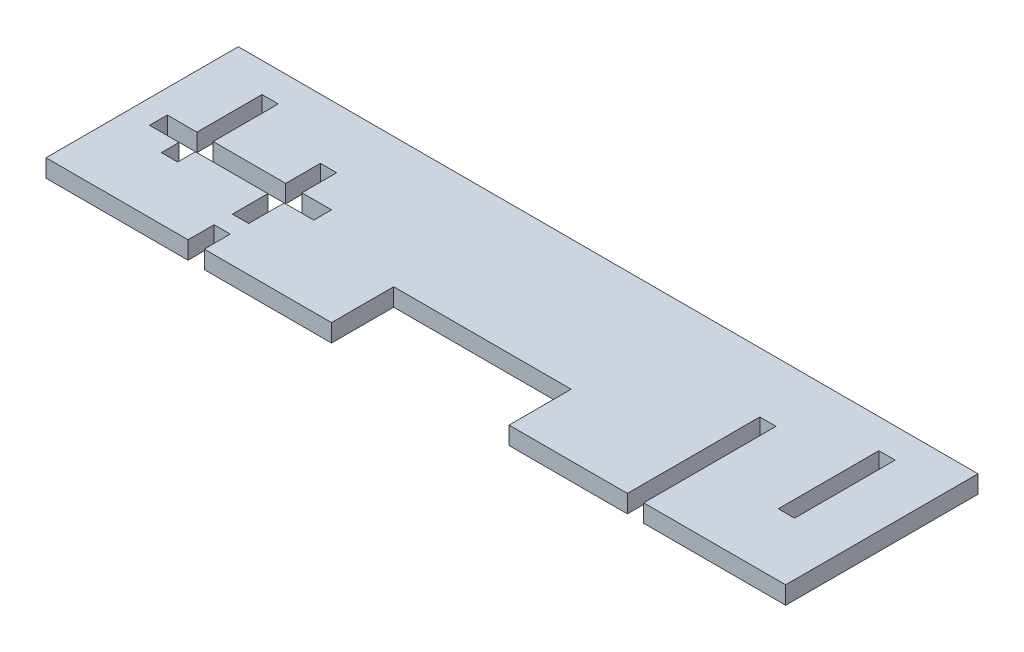
ISO-10303-21;
HEADER;
FILE_DESCRIPTION(('STEP AP214'),'2;1');
FILE_NAME('part.step','',(''),(''),'','','');
FILE_SCHEMA(('AUTOMOTIVE_DESIGN { 1 0 10303 214 1 1 1 1 }'));
ENDSEC;
DATA;
#1=APPLICATION_CONTEXT('core data for automotive mechanical design processes');
#2=APPLICATION_PROTOCOL_DEFINITION('international standard','automotive_design',2000,#1);
#3=PRODUCT_CONTEXT('',#1,'mechanical');
#4=PRODUCT('Part','Part','',(#3));
#5=PRODUCT_RELATED_PRODUCT_CATEGORY('part','',(#4));
#6=PRODUCT_DEFINITION_FORMATION('','',#4);
#7=PRODUCT_DEFINITION_CONTEXT('part definition',#1,'design');
#8=PRODUCT_DEFINITION('design','',#6,#7);
#9=PRODUCT_DEFINITION_SHAPE('','',#8);
#10=(LENGTH_UNIT() NAMED_UNIT(*) SI_UNIT(.MILLI.,.METRE.));
#11=(NAMED_UNIT(*) PLANE_ANGLE_UNIT() SI_UNIT($,.RADIAN.));
#12=(NAMED_UNIT(*) SI_UNIT($,.STERADIAN.) SOLID_ANGLE_UNIT());
#13=UNCERTAINTY_MEASURE_WITH_UNIT(LENGTH_MEASURE(1.E-05),#10,'distance_accuracy_value','');
#14=(GEOMETRIC_REPRESENTATION_CONTEXT(3) GLOBAL_UNCERTAINTY_ASSIGNED_CONTEXT((#13)) GLOBAL_UNIT_ASSIGNED_CONTEXT((#10,
#11,#12)) REPRESENTATION_CONTEXT('',''));
#15=CARTESIAN_POINT('',(0.,0.,0.));
#16=DIRECTION('',(0.,0.,1.));
#17=DIRECTION('',(1.,0.,0.));
#18=AXIS2_PLACEMENT_3D('',#15,#16,#17);
#19=CARTESIAN_POINT('',(48.,0.,-44.75));
#20=DIRECTION('',(-1.,0.,0.));
#21=DIRECTION('',(0.,0.,1.));
#22=AXIS2_PLACEMENT_3D('',#19,#20,#21);
#23=PLANE('',#22);
#24=DIRECTION('',(0.,0.,1.));
#25=VECTOR('',#24,1.);
#26=CARTESIAN_POINT('',(48.,6.,-44.75));
#27=LINE('',#26,#25);
#28=CARTESIAN_POINT('',(48.,6.,-27.));
#29=VERTEX_POINT('',#28);
#30=CARTESIAN_POINT('',(48.,6.,-15.));
#31=VERTEX_POINT('',#30);
#32=EDGE_CURVE('E59',#29,#31,#27,.T.);
#33=ORIENTED_EDGE('',*,*,#32,.T.);
#34=DIRECTION('',(0.,1.,0.));
#35=VECTOR('',#34,1.);
#36=CARTESIAN_POINT('',(48.,0.,-15.));
#37=LINE('',#36,#35);
#38=CARTESIAN_POINT('',(48.,0.,-15.));
#39=VERTEX_POINT('',#38);
#40=EDGE_CURVE('E337',#39,#31,#37,.T.);
#41=ORIENTED_EDGE('',*,*,#40,.F.);
#42=DIRECTION('',(0.,0.,1.));
#43=VECTOR('',#42,1.);
#44=CARTESIAN_POINT('',(48.,0.,-44.75));
#45=LINE('',#44,#43);
#46=CARTESIAN_POINT('',(48.,0.,-27.));
#47=VERTEX_POINT('',#46);
#48=EDGE_CURVE('E535',#47,#39,#45,.T.);
#49=ORIENTED_EDGE('',*,*,#48,.F.);
#50=DIRECTION('',(0.,1.,0.));
#51=VECTOR('',#50,1.);
#52=CARTESIAN_POINT('',(48.,0.,-27.));
#53=LINE('',#52,#51);
#54=EDGE_CURVE('E406',#47,#29,#53,.T.);
#55=ORIENTED_EDGE('',*,*,#54,.T.);
#56=EDGE_LOOP('',(#33,#41,#49,#55));
#57=FACE_BOUND('',#56,.T.);
#58=ADVANCED_FACE('F43',(#57),#23,.F.);
#59=CARTESIAN_POINT('',(53.5,0.,-44.75));
#60=DIRECTION('',(1.,0.,0.));
#61=DIRECTION('',(0.,0.,-1.));
#62=AXIS2_PLACEMENT_3D('',#59,#60,#61);
#63=PLANE('',#62);
#64=DIRECTION('',(0.,0.,1.));
#65=VECTOR('',#64,1.);
#66=CARTESIAN_POINT('',(53.5,0.,0.));
#67=LINE('',#66,#65);
#68=CARTESIAN_POINT('',(53.5,0.,-27.));
#69=VERTEX_POINT('',#68);
#70=CARTESIAN_POINT('',(53.5,0.,-15.));
#71=VERTEX_POINT('',#70);
#72=EDGE_CURVE('E672',#69,#71,#67,.T.);
#73=ORIENTED_EDGE('',*,*,#72,.T.);
#74=DIRECTION('',(0.,1.,0.));
#75=VECTOR('',#74,1.);
#76=CARTESIAN_POINT('',(53.5,0.,-15.));
#77=LINE('',#76,#75);
#78=CARTESIAN_POINT('',(53.5,6.,-15.));
#79=VERTEX_POINT('',#78);
#80=EDGE_CURVE('E341',#71,#79,#77,.T.);
#81=ORIENTED_EDGE('',*,*,#80,.T.);
#82=DIRECTION('',(0.,0.,-1.));
#83=VECTOR('',#82,1.);
#84=CARTESIAN_POINT('',(53.5,6.,-44.75));
#85=LINE('',#84,#83);
#86=CARTESIAN_POINT('',(53.5,6.,-27.));
#87=VERTEX_POINT('',#86);
#88=EDGE_CURVE('E525',#79,#87,#85,.T.);
#89=ORIENTED_EDGE('',*,*,#88,.T.);
#90=DIRECTION('',(0.,-1.,0.));
#91=VECTOR('',#90,1.);
#92=CARTESIAN_POINT('',(53.5,0.,-27.));
#93=LINE('',#92,#91);
#94=EDGE_CURVE('E402',#87,#69,#93,.T.);
#95=ORIENTED_EDGE('',*,*,#94,.T.);
#96=EDGE_LOOP('',(#73,#81,#89,#95));
#97=FACE_BOUND('',#96,.T.);
#98=ADVANCED_FACE('F746',(#97),#63,.F.);
#99=CARTESIAN_POINT('',(48.,6.,-44.75));
#100=VERTEX_POINT('',#99);
#101=CARTESIAN_POINT('',(48.,6.,-33.));
#102=VERTEX_POINT('',#101);
#103=EDGE_CURVE('E315',#100,#102,#27,.T.);
#104=ORIENTED_EDGE('',*,*,#103,.T.);
#105=DIRECTION('',(0.,-1.,0.));
#106=VECTOR('',#105,1.);
#107=CARTESIAN_POINT('',(48.,0.,-33.));
#108=LINE('',#107,#106);
#109=CARTESIAN_POINT('',(48.,0.,-33.));
#110=VERTEX_POINT('',#109);
#111=EDGE_CURVE('E417',#102,#110,#108,.T.);
#112=ORIENTED_EDGE('',*,*,#111,.T.);
#113=CARTESIAN_POINT('',(48.,0.,-44.75));
#114=VERTEX_POINT('',#113);
#115=EDGE_CURVE('E523',#114,#110,#45,.T.);
#116=ORIENTED_EDGE('',*,*,#115,.F.);
#117=DIRECTION('',(0.,1.,0.));
#118=VECTOR('',#117,1.);
#119=CARTESIAN_POINT('',(48.,0.,-44.75));
#120=LINE('',#119,#118);
#121=EDGE_CURVE('E514',#114,#100,#120,.T.);
#122=ORIENTED_EDGE('',*,*,#121,.T.);
#123=EDGE_LOOP('',(#104,#112,#116,#122));
#124=FACE_BOUND('',#123,.T.);
#125=ADVANCED_FACE('F819',(#124),#23,.F.);
#126=CARTESIAN_POINT('',(53.5,0.,-44.75));
#127=VERTEX_POINT('',#126);
#128=CARTESIAN_POINT('',(53.5,0.,-33.));
#129=VERTEX_POINT('',#128);
#130=EDGE_CURVE('E669',#127,#129,#67,.T.);
#131=ORIENTED_EDGE('',*,*,#130,.T.);
#132=DIRECTION('',(0.,1.,0.));
#133=VECTOR('',#132,1.);
#134=CARTESIAN_POINT('',(53.5,0.,-33.));
#135=LINE('',#134,#133);
#136=CARTESIAN_POINT('',(53.5,6.,-33.));
#137=VERTEX_POINT('',#136);
#138=EDGE_CURVE('E413',#129,#137,#135,.T.);
#139=ORIENTED_EDGE('',*,*,#138,.T.);
#140=CARTESIAN_POINT('',(53.5,6.,-44.75));
#141=VERTEX_POINT('',#140);
#142=EDGE_CURVE('E522',#137,#141,#85,.T.);
#143=ORIENTED_EDGE('',*,*,#142,.T.);
#144=DIRECTION('',(0.,1.,0.));
#145=VECTOR('',#144,1.);
#146=CARTESIAN_POINT('',(53.5,0.,-44.75));
#147=LINE('',#146,#145);
#148=EDGE_CURVE('E509',#127,#141,#147,.T.);
#149=ORIENTED_EDGE('',*,*,#148,.F.);
#150=EDGE_LOOP('',(#131,#139,#143,#149));
#151=FACE_BOUND('',#150,.T.);
#152=ADVANCED_FACE('F715',(#151),#63,.F.);
#153=CARTESIAN_POINT('',(18.,0.,-55.));
#154=DIRECTION('',(-1.,0.,0.));
#155=DIRECTION('',(0.,0.,1.));
#156=AXIS2_PLACEMENT_3D('',#153,#154,#155);
#157=PLANE('',#156);
#158=DIRECTION('',(0.,0.,1.));
#159=VECTOR('',#158,1.);
#160=CARTESIAN_POINT('',(18.,6.,-55.));
#161=LINE('',#160,#159);
#162=CARTESIAN_POINT('',(18.,6.,-55.));
#163=VERTEX_POINT('',#162);
#164=CARTESIAN_POINT('',(18.,6.,-33.));
#165=VERTEX_POINT('',#164);
#166=EDGE_CURVE('E477',#163,#165,#161,.T.);
#167=ORIENTED_EDGE('',*,*,#166,.T.);
#168=DIRECTION('',(0.,-1.,0.));
#169=VECTOR('',#168,1.);
#170=CARTESIAN_POINT('',(18.,0.,-33.));
#171=LINE('',#170,#169);
#172=CARTESIAN_POINT('',(18.,0.,-33.));
#173=VERTEX_POINT('',#172);
#174=EDGE_CURVE('E409',#165,#173,#171,.T.);
#175=ORIENTED_EDGE('',*,*,#174,.T.);
#176=DIRECTION('',(0.,0.,1.));
#177=VECTOR('',#176,1.);
#178=CARTESIAN_POINT('',(18.,0.,-55.));
#179=LINE('',#178,#177);
#180=CARTESIAN_POINT('',(18.,0.,-55.));
#181=VERTEX_POINT('',#180);
#182=EDGE_CURVE('E458',#181,#173,#179,.T.);
#183=ORIENTED_EDGE('',*,*,#182,.F.);
#184=DIRECTION('',(0.,1.,0.));
#185=VECTOR('',#184,1.);
#186=CARTESIAN_POINT('',(18.,0.,-55.));
#187=LINE('',#186,#185);
#188=EDGE_CURVE('E495',#181,#163,#187,.T.);
#189=ORIENTED_EDGE('',*,*,#188,.T.);
#190=EDGE_LOOP('',(#167,#175,#183,#189));
#191=FACE_BOUND('',#190,.T.);
#192=ADVANCED_FACE('F1024',(#191),#157,.F.);
#193=CARTESIAN_POINT('',(23.5,0.,-55.));
#194=DIRECTION('',(1.,0.,0.));
#195=DIRECTION('',(0.,0.,-1.));
#196=AXIS2_PLACEMENT_3D('',#193,#194,#195);
#197=PLANE('',#196);
#198=DIRECTION('',(0.,0.,-1.));
#199=VECTOR('',#198,1.);
#200=CARTESIAN_POINT('',(23.5,0.,-55.));
#201=LINE('',#200,#199);
#202=CARTESIAN_POINT('',(23.5,0.,-33.));
#203=VERTEX_POINT('',#202);
#204=CARTESIAN_POINT('',(23.5,0.,-55.));
#205=VERTEX_POINT('',#204);
#206=EDGE_CURVE('E467',#203,#205,#201,.T.);
#207=ORIENTED_EDGE('',*,*,#206,.F.);
#208=DIRECTION('',(0.,1.,0.));
#209=VECTOR('',#208,1.);
#210=CARTESIAN_POINT('',(23.5,0.,-33.));
#211=LINE('',#210,#209);
#212=CARTESIAN_POINT('',(23.5,6.,-33.));
#213=VERTEX_POINT('',#212);
#214=EDGE_CURVE('E11',#203,#213,#211,.T.);
#215=ORIENTED_EDGE('',*,*,#214,.T.);
#216=DIRECTION('',(0.,0.,-1.));
#217=VECTOR('',#216,1.);
#218=CARTESIAN_POINT('',(23.5,6.,-55.));
#219=LINE('',#218,#217);
#220=CARTESIAN_POINT('',(23.5,6.,-55.));
#221=VERTEX_POINT('',#220);
#222=EDGE_CURVE('E486',#213,#221,#219,.T.);
#223=ORIENTED_EDGE('',*,*,#222,.T.);
#224=DIRECTION('',(0.,1.,0.));
#225=VECTOR('',#224,1.);
#226=CARTESIAN_POINT('',(23.5,0.,-55.));
#227=LINE('',#226,#225);
#228=EDGE_CURVE('E499',#205,#221,#227,.T.);
#229=ORIENTED_EDGE('',*,*,#228,.F.);
#230=EDGE_LOOP('',(#207,#215,#223,#229));
#231=FACE_BOUND('',#230,.T.);
#232=ADVANCED_FACE('F815',(#231),#197,.F.);
#233=CARTESIAN_POINT('',(0.,6.,0.));
#234=DIRECTION('',(0.,0.,-1.));
#235=DIRECTION('',(-1.,0.,0.));
#236=AXIS2_PLACEMENT_3D('',#233,#234,#235);
#237=PLANE('',#236);
#238=DIRECTION('',(1.,0.,0.));
#239=VECTOR('',#238,1.);
#240=CARTESIAN_POINT('',(0.,6.,0.));
#241=LINE('',#240,#239);
#242=CARTESIAN_POINT('',(156.5,6.,0.));
#243=VERTEX_POINT('',#242);
#244=CARTESIAN_POINT('',(196.5,6.,0.));
#245=VERTEX_POINT('',#244);
#246=EDGE_CURVE('E628',#243,#245,#241,.T.);
#247=ORIENTED_EDGE('',*,*,#246,.F.);
#248=DIRECTION('',(0.,1.,0.));
#249=VECTOR('',#248,1.);
#250=CARTESIAN_POINT('',(156.5,0.,0.));
#251=LINE('',#250,#249);
#252=CARTESIAN_POINT('',(156.5,0.,0.));
#253=VERTEX_POINT('',#252);
#254=EDGE_CURVE('E445',#253,#243,#251,.T.);
#255=ORIENTED_EDGE('',*,*,#254,.F.);
#256=DIRECTION('',(1.,0.,0.));
#257=VECTOR('',#256,1.);
#258=CARTESIAN_POINT('',(0.,0.,0.));
#259=LINE('',#258,#257);
#260=CARTESIAN_POINT('',(196.5,0.,0.));
#261=VERTEX_POINT('',#260);
#262=EDGE_CURVE('E645',#253,#261,#259,.T.);
#263=ORIENTED_EDGE('',*,*,#262,.T.);
#264=DIRECTION('',(0.,1.,0.));
#265=VECTOR('',#264,1.);
#266=CARTESIAN_POINT('',(196.5,6.,0.));
#267=LINE('',#266,#265);
#268=EDGE_CURVE('E498',#261,#245,#267,.T.);
#269=ORIENTED_EDGE('',*,*,#268,.T.);
#270=EDGE_LOOP('',(#247,#255,#263,#269));
#271=FACE_BOUND('',#270,.T.);
#272=ADVANCED_FACE('F776',(#271),#237,.F.);
#273=CARTESIAN_POINT('',(0.,0.,0.));
#274=VERTEX_POINT('',#273);
#275=CARTESIAN_POINT('',(48.,0.,0.));
#276=VERTEX_POINT('',#275);
#277=EDGE_CURVE('E639',#274,#276,#259,.T.);
#278=ORIENTED_EDGE('',*,*,#277,.T.);
#279=DIRECTION('',(0.,1.,0.));
#280=VECTOR('',#279,1.);
#281=CARTESIAN_POINT('',(48.,6.,0.));
#282=LINE('',#281,#280);
#283=CARTESIAN_POINT('',(48.,6.,0.));
#284=VERTEX_POINT('',#283);
#285=EDGE_CURVE('E615',#276,#284,#282,.T.);
#286=ORIENTED_EDGE('',*,*,#285,.T.);
#287=CARTESIAN_POINT('',(0.,6.,0.));
#288=VERTEX_POINT('',#287);
#289=EDGE_CURVE('E310',#288,#284,#241,.T.);
#290=ORIENTED_EDGE('',*,*,#289,.F.);
#291=DIRECTION('',(0.,-1.,0.));
#292=VECTOR('',#291,1.);
#293=CARTESIAN_POINT('',(0.,6.,0.));
#294=LINE('',#293,#292);
#295=EDGE_CURVE('E661',#288,#274,#294,.T.);
#296=ORIENTED_EDGE('',*,*,#295,.T.);
#297=EDGE_LOOP('',(#278,#286,#290,#296));
#298=FACE_BOUND('',#297,.T.);
#299=ADVANCED_FACE('F809',(#298),#237,.F.);
#300=CARTESIAN_POINT('',(202.,6.,0.));
#301=VERTEX_POINT('',#300);
#302=CARTESIAN_POINT('',(250.,6.,0.));
#303=VERTEX_POINT('',#302);
#304=EDGE_CURVE('E622',#301,#303,#241,.T.);
#305=ORIENTED_EDGE('',*,*,#304,.F.);
#306=DIRECTION('',(0.,-1.,0.));
#307=VECTOR('',#306,1.);
#308=CARTESIAN_POINT('',(202.,6.,0.));
#309=LINE('',#308,#307);
#310=CARTESIAN_POINT('',(202.,0.,0.));
#311=VERTEX_POINT('',#310);
#312=EDGE_CURVE('E607',#301,#311,#309,.T.);
#313=ORIENTED_EDGE('',*,*,#312,.T.);
#314=CARTESIAN_POINT('',(250.,0.,0.));
#315=VERTEX_POINT('',#314);
#316=EDGE_CURVE('E638',#311,#315,#259,.T.);
#317=ORIENTED_EDGE('',*,*,#316,.T.);
#318=DIRECTION('',(0.,-1.,0.));
#319=VECTOR('',#318,1.);
#320=CARTESIAN_POINT('',(250.,6.,0.));
#321=LINE('',#320,#319);
#322=EDGE_CURVE('E657',#303,#315,#321,.T.);
#323=ORIENTED_EDGE('',*,*,#322,.F.);
#324=EDGE_LOOP('',(#305,#313,#317,#323));
#325=FACE_BOUND('',#324,.T.);
#326=ADVANCED_FACE('F793',(#325),#237,.F.);
#327=CARTESIAN_POINT('',(0.,6.,0.));
#328=DIRECTION('',(1.,0.,0.));
#329=DIRECTION('',(0.,0.,-1.));
#330=AXIS2_PLACEMENT_3D('',#327,#328,#329);
#331=PLANE('',#330);
#332=DIRECTION('',(0.,0.,1.));
#333=VECTOR('',#332,1.);
#334=CARTESIAN_POINT('',(0.,0.,0.));
#335=LINE('',#334,#333);
#336=CARTESIAN_POINT('',(0.,0.,-65.));
#337=VERTEX_POINT('',#336);
#338=EDGE_CURVE('E618',#337,#274,#335,.T.);
#339=ORIENTED_EDGE('',*,*,#338,.T.);
#340=ORIENTED_EDGE('',*,*,#295,.F.);
#341=DIRECTION('',(0.,0.,1.));
#342=VECTOR('',#341,1.);
#343=CARTESIAN_POINT('',(0.,6.,0.));
#344=LINE('',#343,#342);
#345=CARTESIAN_POINT('',(0.,6.,-65.));
#346=VERTEX_POINT('',#345);
#347=EDGE_CURVE('E619',#346,#288,#344,.T.);
#348=ORIENTED_EDGE('',*,*,#347,.F.);
#349=DIRECTION('',(0.,-1.,0.));
#350=VECTOR('',#349,1.);
#351=CARTESIAN_POINT('',(0.,6.,-65.));
#352=LINE('',#351,#350);
#353=EDGE_CURVE('E634',#346,#337,#352,.T.);
#354=ORIENTED_EDGE('',*,*,#353,.T.);
#355=EDGE_LOOP('',(#339,#340,#348,#354));
#356=FACE_BOUND('',#355,.T.);
#357=ADVANCED_FACE('F45',(#356),#331,.F.);
#358=CARTESIAN_POINT('',(53.5,0.,0.));
#359=VERTEX_POINT('',#358);
#360=CARTESIAN_POINT('',(96.5,0.,0.));
#361=VERTEX_POINT('',#360);
#362=EDGE_CURVE('E644',#359,#361,#259,.T.);
#363=ORIENTED_EDGE('',*,*,#362,.T.);
#364=DIRECTION('',(0.,1.,0.));
#365=VECTOR('',#364,1.);
#366=CARTESIAN_POINT('',(96.5,0.,0.));
#367=LINE('',#366,#365);
#368=CARTESIAN_POINT('',(96.5,6.,0.));
#369=VERTEX_POINT('',#368);
#370=EDGE_CURVE('E449',#361,#369,#367,.T.);
#371=ORIENTED_EDGE('',*,*,#370,.T.);
#372=CARTESIAN_POINT('',(53.5,6.,0.));
#373=VERTEX_POINT('',#372);
#374=EDGE_CURVE('E627',#373,#369,#241,.T.);
#375=ORIENTED_EDGE('',*,*,#374,.F.);
#376=DIRECTION('',(0.,-1.,0.));
#377=VECTOR('',#376,1.);
#378=CARTESIAN_POINT('',(53.5,6.,0.));
#379=LINE('',#378,#377);
#380=EDGE_CURVE('E611',#373,#359,#379,.T.);
#381=ORIENTED_EDGE('',*,*,#380,.T.);
#382=EDGE_LOOP('',(#363,#371,#375,#381));
#383=FACE_BOUND('',#382,.T.);
#384=ADVANCED_FACE('F760',(#383),#237,.F.);
#385=CARTESIAN_POINT('',(250.,6.,0.));
#386=DIRECTION('',(-1.,0.,0.));
#387=DIRECTION('',(0.,0.,1.));
#388=AXIS2_PLACEMENT_3D('',#385,#386,#387);
#389=PLANE('',#388);
#390=DIRECTION('',(0.,0.,-1.));
#391=VECTOR('',#390,1.);
#392=CARTESIAN_POINT('',(250.,0.,0.));
#393=LINE('',#392,#391);
#394=CARTESIAN_POINT('',(250.,0.,-65.));
#395=VERTEX_POINT('',#394);
#396=EDGE_CURVE('E643',#315,#395,#393,.T.);
#397=ORIENTED_EDGE('',*,*,#396,.T.);
#398=DIRECTION('',(0.,-1.,0.));
#399=VECTOR('',#398,1.);
#400=CARTESIAN_POINT('',(250.,6.,-65.));
#401=LINE('',#400,#399);
#402=CARTESIAN_POINT('',(250.,6.,-65.));
#403=VERTEX_POINT('',#402);
#404=EDGE_CURVE('E653',#403,#395,#401,.T.);
#405=ORIENTED_EDGE('',*,*,#404,.F.);
#406=DIRECTION('',(0.,0.,-1.));
#407=VECTOR('',#406,1.);
#408=CARTESIAN_POINT('',(250.,6.,0.));
#409=LINE('',#408,#407);
#410=EDGE_CURVE('E626',#303,#403,#409,.T.);
#411=ORIENTED_EDGE('',*,*,#410,.F.);
#412=ORIENTED_EDGE('',*,*,#322,.T.);
#413=EDGE_LOOP('',(#397,#405,#411,#412));
#414=FACE_BOUND('',#413,.T.);
#415=ADVANCED_FACE('F798',(#414),#389,.F.);
#416=CARTESIAN_POINT('',(0.,6.,-65.));
#417=DIRECTION('',(0.,0.,1.));
#418=DIRECTION('',(1.,0.,0.));
#419=AXIS2_PLACEMENT_3D('',#416,#417,#418);
#420=PLANE('',#419);
#421=DIRECTION('',(-1.,0.,0.));
#422=VECTOR('',#421,1.);
#423=CARTESIAN_POINT('',(0.,0.,-65.));
#424=LINE('',#423,#422);
#425=EDGE_CURVE('E623',#395,#337,#424,.T.);
#426=ORIENTED_EDGE('',*,*,#425,.T.);
#427=ORIENTED_EDGE('',*,*,#353,.F.);
#428=DIRECTION('',(-1.,0.,0.));
#429=VECTOR('',#428,1.);
#430=CARTESIAN_POINT('',(0.,6.,-65.));
#431=LINE('',#430,#429);
#432=EDGE_CURVE('E631',#403,#346,#431,.T.);
#433=ORIENTED_EDGE('',*,*,#432,.F.);
#434=ORIENTED_EDGE('',*,*,#404,.T.);
#435=EDGE_LOOP('',(#426,#427,#433,#434));
#436=FACE_BOUND('',#435,.T.);
#437=ADVANCED_FACE('F804',(#436),#420,.F.);
#438=CARTESIAN_POINT('',(0.,6.,0.));
#439=DIRECTION('',(0.,-1.,0.));
#440=DIRECTION('',(0.,0.,-1.));
#441=AXIS2_PLACEMENT_3D('',#438,#439,#440);
#442=PLANE('',#441);
#443=CARTESIAN_POINT('',(48.,6.,-8.80000000000001));
#444=VERTEX_POINT('',#443);
#445=EDGE_CURVE('E303',#444,#284,#27,.T.);
#446=ORIENTED_EDGE('',*,*,#445,.F.);
#447=DIRECTION('',(1.,0.,0.));
#448=VECTOR('',#447,1.);
#449=CARTESIAN_POINT('',(48.,6.,-8.80000000000001));
#450=LINE('',#449,#448);
#451=CARTESIAN_POINT('',(53.5,6.,-8.80000000000001));
#452=VERTEX_POINT('',#451);
#453=EDGE_CURVE('E308',#444,#452,#450,.T.);
#454=ORIENTED_EDGE('',*,*,#453,.T.);
#455=EDGE_CURVE('E313',#373,#452,#85,.T.);
#456=ORIENTED_EDGE('',*,*,#455,.F.);
#457=ORIENTED_EDGE('',*,*,#374,.T.);
#458=DIRECTION('',(0.,0.,1.));
#459=VECTOR('',#458,1.);
#460=CARTESIAN_POINT('',(96.5,6.,0.));
#461=LINE('',#460,#459);
#462=CARTESIAN_POINT('',(96.5,6.,-21.));
#463=VERTEX_POINT('',#462);
#464=EDGE_CURVE('E427',#463,#369,#461,.T.);
#465=ORIENTED_EDGE('',*,*,#464,.F.);
#466=DIRECTION('',(-1.,0.,0.));
#467=VECTOR('',#466,1.);
#468=CARTESIAN_POINT('',(156.5,6.,-21.));
#469=LINE('',#468,#467);
#470=CARTESIAN_POINT('',(156.5,6.,-21.));
#471=VERTEX_POINT('',#470);
#472=EDGE_CURVE('E439',#471,#463,#469,.T.);
#473=ORIENTED_EDGE('',*,*,#472,.F.);
#474=DIRECTION('',(0.,0.,-1.));
#475=VECTOR('',#474,1.);
#476=CARTESIAN_POINT('',(156.5,6.,0.));
#477=LINE('',#476,#475);
#478=EDGE_CURVE('E421',#243,#471,#477,.T.);
#479=ORIENTED_EDGE('',*,*,#478,.F.);
#480=ORIENTED_EDGE('',*,*,#246,.T.);
#481=DIRECTION('',(0.,0.,1.));
#482=VECTOR('',#481,1.);
#483=CARTESIAN_POINT('',(196.5,6.,-44.75));
#484=LINE('',#483,#482);
#485=CARTESIAN_POINT('',(196.5,6.,-44.75));
#486=VERTEX_POINT('',#485);
#487=EDGE_CURVE('E548',#486,#245,#484,.T.);
#488=ORIENTED_EDGE('',*,*,#487,.F.);
#489=DIRECTION('',(-1.,0.,0.));
#490=VECTOR('',#489,1.);
#491=CARTESIAN_POINT('',(202.,6.,-44.75));
#492=LINE('',#491,#490);
#493=CARTESIAN_POINT('',(202.,6.,-44.75));
#494=VERTEX_POINT('',#493);
#495=EDGE_CURVE('E517',#494,#486,#492,.T.);
#496=ORIENTED_EDGE('',*,*,#495,.F.);
#497=DIRECTION('',(0.,0.,-1.));
#498=VECTOR('',#497,1.);
#499=CARTESIAN_POINT('',(202.,6.,-44.75));
#500=LINE('',#499,#498);
#501=EDGE_CURVE('E545',#301,#494,#500,.T.);
#502=ORIENTED_EDGE('',*,*,#501,.F.);
#503=ORIENTED_EDGE('',*,*,#304,.T.);
#504=ORIENTED_EDGE('',*,*,#410,.T.);
#505=ORIENTED_EDGE('',*,*,#432,.T.);
#506=ORIENTED_EDGE('',*,*,#347,.T.);
#507=ORIENTED_EDGE('',*,*,#289,.T.);
#508=EDGE_LOOP('',(#446,#454,#456,#457,#465,#473,#479,#480,#488,#496,#502,#503,#504,#505,#506,#507));
#509=FACE_BOUND('',#508,.T.);
#510=DIRECTION('',(0.,0.,1.));
#511=VECTOR('',#510,1.);
#512=CARTESIAN_POINT('',(226.5,6.,-55.));
#513=LINE('',#512,#511);
#514=CARTESIAN_POINT('',(226.5,6.,-55.));
#515=VERTEX_POINT('',#514);
#516=CARTESIAN_POINT('',(226.5,6.,-21.));
#517=VERTEX_POINT('',#516);
#518=EDGE_CURVE('E584',#515,#517,#513,.T.);
#519=ORIENTED_EDGE('',*,*,#518,.F.);
#520=DIRECTION('',(-1.,0.,0.));
#521=VECTOR('',#520,1.);
#522=CARTESIAN_POINT('',(232.,6.,-55.));
#523=LINE('',#522,#521);
#524=CARTESIAN_POINT('',(232.,6.,-55.));
#525=VERTEX_POINT('',#524);
#526=EDGE_CURVE('E544',#525,#515,#523,.T.);
#527=ORIENTED_EDGE('',*,*,#526,.F.);
#528=DIRECTION('',(0.,0.,-1.));
#529=VECTOR('',#528,1.);
#530=CARTESIAN_POINT('',(232.,6.,-55.));
#531=LINE('',#530,#529);
#532=CARTESIAN_POINT('',(232.,6.,-21.));
#533=VERTEX_POINT('',#532);
#534=EDGE_CURVE('E575',#533,#525,#531,.T.);
#535=ORIENTED_EDGE('',*,*,#534,.F.);
#536=DIRECTION('',(1.,0.,0.));
#537=VECTOR('',#536,1.);
#538=CARTESIAN_POINT('',(232.,6.,-21.));
#539=LINE('',#538,#537);
#540=EDGE_CURVE('E579',#517,#533,#539,.T.);
#541=ORIENTED_EDGE('',*,*,#540,.F.);
#542=EDGE_LOOP('',(#519,#527,#535,#541));
#543=FACE_BOUND('',#542,.T.);
#544=ORIENTED_EDGE('',*,*,#222,.F.);
#545=DIRECTION('',(-1.,0.,0.));
#546=VECTOR('',#545,1.);
#547=CARTESIAN_POINT('',(8.,6.,-33.));
#548=LINE('',#547,#546);
#549=EDGE_CURVE('E384',#102,#213,#548,.T.);
#550=ORIENTED_EDGE('',*,*,#549,.F.);
#551=ORIENTED_EDGE('',*,*,#103,.F.);
#552=DIRECTION('',(-1.,0.,0.));
#553=VECTOR('',#552,1.);
#554=CARTESIAN_POINT('',(48.,6.,-44.75));
#555=LINE('',#554,#553);
#556=EDGE_CURVE('E518',#141,#100,#555,.T.);
#557=ORIENTED_EDGE('',*,*,#556,.F.);
#558=ORIENTED_EDGE('',*,*,#142,.F.);
#559=CARTESIAN_POINT('',(63.5,6.,-33.));
#560=VERTEX_POINT('',#559);
#561=EDGE_CURVE('E352',#560,#137,#548,.T.);
#562=ORIENTED_EDGE('',*,*,#561,.F.);
#563=DIRECTION('',(0.,0.,-1.));
#564=VECTOR('',#563,1.);
#565=CARTESIAN_POINT('',(63.5,6.,-33.));
#566=LINE('',#565,#564);
#567=CARTESIAN_POINT('',(63.5,6.,-27.));
#568=VERTEX_POINT('',#567);
#569=EDGE_CURVE('E376',#568,#560,#566,.T.);
#570=ORIENTED_EDGE('',*,*,#569,.F.);
#571=DIRECTION('',(1.,0.,0.));
#572=VECTOR('',#571,1.);
#573=CARTESIAN_POINT('',(8.00000000000001,6.,-27.));
#574=LINE('',#573,#572);
#575=EDGE_CURVE('E372',#87,#568,#574,.T.);
#576=ORIENTED_EDGE('',*,*,#575,.F.);
#577=ORIENTED_EDGE('',*,*,#88,.F.);
#578=DIRECTION('',(-1.,0.,0.));
#579=VECTOR('',#578,1.);
#580=CARTESIAN_POINT('',(48.,6.,-15.));
#581=LINE('',#580,#579);
#582=EDGE_CURVE('E328',#79,#31,#581,.T.);
#583=ORIENTED_EDGE('',*,*,#582,.T.);
#584=ORIENTED_EDGE('',*,*,#32,.F.);
#585=CARTESIAN_POINT('',(23.5,6.,-27.));
#586=VERTEX_POINT('',#585);
#587=EDGE_CURVE('E377',#586,#29,#574,.T.);
#588=ORIENTED_EDGE('',*,*,#587,.F.);
#589=CARTESIAN_POINT('',(23.5,6.,-21.));
#590=VERTEX_POINT('',#589);
#591=EDGE_CURVE('E487',#590,#586,#219,.T.);
#592=ORIENTED_EDGE('',*,*,#591,.F.);
#593=DIRECTION('',(1.,0.,0.));
#594=VECTOR('',#593,1.);
#595=CARTESIAN_POINT('',(18.,6.,-21.));
#596=LINE('',#595,#594);
#597=CARTESIAN_POINT('',(18.,6.,-21.));
#598=VERTEX_POINT('',#597);
#599=EDGE_CURVE('E481',#598,#590,#596,.T.);
#600=ORIENTED_EDGE('',*,*,#599,.F.);
#601=CARTESIAN_POINT('',(18.,6.,-27.));
#602=VERTEX_POINT('',#601);
#603=EDGE_CURVE('E482',#602,#598,#161,.T.);
#604=ORIENTED_EDGE('',*,*,#603,.F.);
#605=CARTESIAN_POINT('',(8.00000000000001,6.,-27.));
#606=VERTEX_POINT('',#605);
#607=EDGE_CURVE('E373',#606,#602,#574,.T.);
#608=ORIENTED_EDGE('',*,*,#607,.F.);
#609=DIRECTION('',(0.,0.,1.));
#610=VECTOR('',#609,1.);
#611=CARTESIAN_POINT('',(8.,6.,-33.));
#612=LINE('',#611,#610);
#613=CARTESIAN_POINT('',(8.,6.,-33.));
#614=VERTEX_POINT('',#613);
#615=EDGE_CURVE('E340',#614,#606,#612,.T.);
#616=ORIENTED_EDGE('',*,*,#615,.F.);
#617=EDGE_CURVE('E381',#165,#614,#548,.T.);
#618=ORIENTED_EDGE('',*,*,#617,.F.);
#619=ORIENTED_EDGE('',*,*,#166,.F.);
#620=DIRECTION('',(-1.,0.,0.));
#621=VECTOR('',#620,1.);
#622=CARTESIAN_POINT('',(18.,6.,-55.));
#623=LINE('',#622,#621);
#624=EDGE_CURVE('E491',#221,#163,#623,.T.);
#625=ORIENTED_EDGE('',*,*,#624,.F.);
#626=EDGE_LOOP('',(#544,#550,#551,#557,#558,#562,#570,#576,#577,#583,#584,#588,#592,#600,#604,
#608,#616,#618,#619,#625));
#627=FACE_BOUND('',#626,.T.);
#628=ADVANCED_FACE('F304',(#509,#543,#627),#442,.F.);
#629=CARTESIAN_POINT('',(0.,0.,0.));
#630=DIRECTION('',(0.,-1.,0.));
#631=DIRECTION('',(0.,0.,-1.));
#632=AXIS2_PLACEMENT_3D('',#629,#630,#631);
#633=PLANE('',#632);
#634=DIRECTION('',(1.,0.,0.));
#635=VECTOR('',#634,1.);
#636=CARTESIAN_POINT('',(48.,0.,-8.80000000000001));
#637=LINE('',#636,#635);
#638=CARTESIAN_POINT('',(48.,0.,-8.80000000000001));
#639=VERTEX_POINT('',#638);
#640=CARTESIAN_POINT('',(53.5,0.,-8.80000000000001));
#641=VERTEX_POINT('',#640);
#642=EDGE_CURVE('E332',#639,#641,#637,.T.);
#643=ORIENTED_EDGE('',*,*,#642,.F.);
#644=EDGE_CURVE('E67',#639,#276,#45,.T.);
#645=ORIENTED_EDGE('',*,*,#644,.T.);
#646=ORIENTED_EDGE('',*,*,#277,.F.);
#647=ORIENTED_EDGE('',*,*,#338,.F.);
#648=ORIENTED_EDGE('',*,*,#425,.F.);
#649=ORIENTED_EDGE('',*,*,#396,.F.);
#650=ORIENTED_EDGE('',*,*,#316,.F.);
#651=DIRECTION('',(0.,0.,1.));
#652=VECTOR('',#651,1.);
#653=CARTESIAN_POINT('',(202.,0.,0.));
#654=LINE('',#653,#652);
#655=CARTESIAN_POINT('',(202.,0.,-44.75));
#656=VERTEX_POINT('',#655);
#657=EDGE_CURVE('E665',#656,#311,#654,.T.);
#658=ORIENTED_EDGE('',*,*,#657,.F.);
#659=DIRECTION('',(-1.,0.,0.));
#660=VECTOR('',#659,1.);
#661=CARTESIAN_POINT('',(202.,0.,-44.75));
#662=LINE('',#661,#660);
#663=CARTESIAN_POINT('',(196.5,0.,-44.75));
#664=VERTEX_POINT('',#663);
#665=EDGE_CURVE('E549',#656,#664,#662,.T.);
#666=ORIENTED_EDGE('',*,*,#665,.T.);
#667=DIRECTION('',(0.,0.,1.));
#668=VECTOR('',#667,1.);
#669=CARTESIAN_POINT('',(196.5,0.,-44.75));
#670=LINE('',#669,#668);
#671=EDGE_CURVE('E539',#664,#261,#670,.T.);
#672=ORIENTED_EDGE('',*,*,#671,.T.);
#673=ORIENTED_EDGE('',*,*,#262,.F.);
#674=DIRECTION('',(0.,0.,-1.));
#675=VECTOR('',#674,1.);
#676=CARTESIAN_POINT('',(156.5,0.,0.));
#677=LINE('',#676,#675);
#678=CARTESIAN_POINT('',(156.5,0.,-21.));
#679=VERTEX_POINT('',#678);
#680=EDGE_CURVE('E422',#253,#679,#677,.T.);
#681=ORIENTED_EDGE('',*,*,#680,.T.);
#682=DIRECTION('',(-1.,0.,0.));
#683=VECTOR('',#682,1.);
#684=CARTESIAN_POINT('',(156.5,0.,-21.));
#685=LINE('',#684,#683);
#686=CARTESIAN_POINT('',(96.5,0.,-21.));
#687=VERTEX_POINT('',#686);
#688=EDGE_CURVE('E426',#679,#687,#685,.T.);
#689=ORIENTED_EDGE('',*,*,#688,.T.);
#690=DIRECTION('',(0.,0.,1.));
#691=VECTOR('',#690,1.);
#692=CARTESIAN_POINT('',(96.5,0.,0.));
#693=LINE('',#692,#691);
#694=EDGE_CURVE('E431',#687,#361,#693,.T.);
#695=ORIENTED_EDGE('',*,*,#694,.T.);
#696=ORIENTED_EDGE('',*,*,#362,.F.);
#697=EDGE_CURVE('E668',#641,#359,#67,.T.);
#698=ORIENTED_EDGE('',*,*,#697,.F.);
#699=EDGE_LOOP('',(#643,#645,#646,#647,#648,#649,#650,#658,#666,#672,#673,#681,#689,#695,#696,#698));
#700=FACE_BOUND('',#699,.T.);
#701=DIRECTION('',(-1.,0.,0.));
#702=VECTOR('',#701,1.);
#703=CARTESIAN_POINT('',(8.,0.,-33.));
#704=LINE('',#703,#702);
#705=EDGE_CURVE('E368',#110,#203,#704,.T.);
#706=ORIENTED_EDGE('',*,*,#705,.T.);
#707=ORIENTED_EDGE('',*,*,#206,.T.);
#708=DIRECTION('',(-1.,0.,0.));
#709=VECTOR('',#708,1.);
#710=CARTESIAN_POINT('',(18.,0.,-55.));
#711=LINE('',#710,#709);
#712=EDGE_CURVE('E472',#205,#181,#711,.T.);
#713=ORIENTED_EDGE('',*,*,#712,.T.);
#714=ORIENTED_EDGE('',*,*,#182,.T.);
#715=CARTESIAN_POINT('',(8.,0.,-33.));
#716=VERTEX_POINT('',#715);
#717=EDGE_CURVE('E362',#173,#716,#704,.T.);
#718=ORIENTED_EDGE('',*,*,#717,.T.);
#719=DIRECTION('',(0.,0.,1.));
#720=VECTOR('',#719,1.);
#721=CARTESIAN_POINT('',(8.,0.,-33.));
#722=LINE('',#721,#720);
#723=CARTESIAN_POINT('',(8.00000000000001,0.,-27.));
#724=VERTEX_POINT('',#723);
#725=EDGE_CURVE('E347',#716,#724,#722,.T.);
#726=ORIENTED_EDGE('',*,*,#725,.T.);
#727=DIRECTION('',(1.,0.,0.));
#728=VECTOR('',#727,1.);
#729=CARTESIAN_POINT('',(8.00000000000001,0.,-27.));
#730=LINE('',#729,#728);
#731=CARTESIAN_POINT('',(18.,0.,-27.));
#732=VERTEX_POINT('',#731);
#733=EDGE_CURVE('E353',#724,#732,#730,.T.);
#734=ORIENTED_EDGE('',*,*,#733,.T.);
#735=CARTESIAN_POINT('',(18.,0.,-21.));
#736=VERTEX_POINT('',#735);
#737=EDGE_CURVE('E463',#732,#736,#179,.T.);
#738=ORIENTED_EDGE('',*,*,#737,.T.);
#739=DIRECTION('',(1.,0.,0.));
#740=VECTOR('',#739,1.);
#741=CARTESIAN_POINT('',(18.,0.,-21.));
#742=LINE('',#741,#740);
#743=CARTESIAN_POINT('',(23.5,0.,-21.));
#744=VERTEX_POINT('',#743);
#745=EDGE_CURVE('E462',#736,#744,#742,.T.);
#746=ORIENTED_EDGE('',*,*,#745,.T.);
#747=CARTESIAN_POINT('',(23.5,0.,-27.));
#748=VERTEX_POINT('',#747);
#749=EDGE_CURVE('E468',#744,#748,#201,.T.);
#750=ORIENTED_EDGE('',*,*,#749,.T.);
#751=EDGE_CURVE('E358',#748,#47,#730,.T.);
#752=ORIENTED_EDGE('',*,*,#751,.T.);
#753=ORIENTED_EDGE('',*,*,#48,.T.);
#754=DIRECTION('',(-1.,0.,0.));
#755=VECTOR('',#754,1.);
#756=CARTESIAN_POINT('',(48.,0.,-15.));
#757=LINE('',#756,#755);
#758=EDGE_CURVE('E323',#71,#39,#757,.T.);
#759=ORIENTED_EDGE('',*,*,#758,.F.);
#760=ORIENTED_EDGE('',*,*,#72,.F.);
#761=CARTESIAN_POINT('',(63.5,0.,-27.));
#762=VERTEX_POINT('',#761);
#763=EDGE_CURVE('E351',#69,#762,#730,.T.);
#764=ORIENTED_EDGE('',*,*,#763,.T.);
#765=DIRECTION('',(0.,0.,-1.));
#766=VECTOR('',#765,1.);
#767=CARTESIAN_POINT('',(63.5,0.,-33.));
#768=LINE('',#767,#766);
#769=CARTESIAN_POINT('',(63.5,0.,-33.));
#770=VERTEX_POINT('',#769);
#771=EDGE_CURVE('E357',#762,#770,#768,.T.);
#772=ORIENTED_EDGE('',*,*,#771,.T.);
#773=EDGE_CURVE('E363',#770,#129,#704,.T.);
#774=ORIENTED_EDGE('',*,*,#773,.T.);
#775=ORIENTED_EDGE('',*,*,#130,.F.);
#776=DIRECTION('',(-1.,0.,0.));
#777=VECTOR('',#776,1.);
#778=CARTESIAN_POINT('',(48.,0.,-44.75));
#779=LINE('',#778,#777);
#780=EDGE_CURVE('E513',#127,#114,#779,.T.);
#781=ORIENTED_EDGE('',*,*,#780,.T.);
#782=ORIENTED_EDGE('',*,*,#115,.T.);
#783=EDGE_LOOP('',(#706,#707,#713,#714,#718,#726,#734,#738,#746,#750,#752,#753,#759,#760,#764,
#772,#774,#775,#781,#782));
#784=FACE_BOUND('',#783,.T.);
#785=DIRECTION('',(-1.,0.,0.));
#786=VECTOR('',#785,1.);
#787=CARTESIAN_POINT('',(232.,0.,-55.));
#788=LINE('',#787,#786);
#789=CARTESIAN_POINT('',(232.,0.,-55.));
#790=VERTEX_POINT('',#789);
#791=CARTESIAN_POINT('',(226.5,0.,-55.));
#792=VERTEX_POINT('',#791);
#793=EDGE_CURVE('E580',#790,#792,#788,.T.);
#794=ORIENTED_EDGE('',*,*,#793,.T.);
#795=DIRECTION('',(0.,0.,1.));
#796=VECTOR('',#795,1.);
#797=CARTESIAN_POINT('',(226.5,0.,-55.));
#798=LINE('',#797,#796);
#799=CARTESIAN_POINT('',(226.5,0.,-21.));
#800=VERTEX_POINT('',#799);
#801=EDGE_CURVE('E597',#792,#800,#798,.T.);
#802=ORIENTED_EDGE('',*,*,#801,.T.);
#803=DIRECTION('',(1.,0.,0.));
#804=VECTOR('',#803,1.);
#805=CARTESIAN_POINT('',(232.,0.,-21.));
#806=LINE('',#805,#804);
#807=CARTESIAN_POINT('',(232.,0.,-21.));
#808=VERTEX_POINT('',#807);
#809=EDGE_CURVE('E593',#800,#808,#806,.T.);
#810=ORIENTED_EDGE('',*,*,#809,.T.);
#811=DIRECTION('',(0.,0.,-1.));
#812=VECTOR('',#811,1.);
#813=CARTESIAN_POINT('',(232.,0.,-55.));
#814=LINE('',#813,#812);
#815=EDGE_CURVE('E566',#808,#790,#814,.T.);
#816=ORIENTED_EDGE('',*,*,#815,.T.);
#817=EDGE_LOOP('',(#794,#802,#810,#816));
#818=FACE_BOUND('',#817,.T.);
#819=ADVANCED_FACE('F684',(#700,#784,#818),#633,.T.);
#820=CARTESIAN_POINT('',(232.,0.,-55.));
#821=DIRECTION('',(0.,0.,-1.));
#822=DIRECTION('',(-1.,0.,0.));
#823=AXIS2_PLACEMENT_3D('',#820,#821,#822);
#824=PLANE('',#823);
#825=ORIENTED_EDGE('',*,*,#526,.T.);
#826=DIRECTION('',(0.,1.,0.));
#827=VECTOR('',#826,1.);
#828=CARTESIAN_POINT('',(226.5,0.,-55.));
#829=LINE('',#828,#827);
#830=EDGE_CURVE('E562',#792,#515,#829,.T.);
#831=ORIENTED_EDGE('',*,*,#830,.F.);
#832=ORIENTED_EDGE('',*,*,#793,.F.);
#833=DIRECTION('',(0.,1.,0.));
#834=VECTOR('',#833,1.);
#835=CARTESIAN_POINT('',(232.,0.,-55.));
#836=LINE('',#835,#834);
#837=EDGE_CURVE('E448',#790,#525,#836,.T.);
#838=ORIENTED_EDGE('',*,*,#837,.T.);
#839=EDGE_LOOP('',(#825,#831,#832,#838));
#840=FACE_BOUND('',#839,.T.);
#841=ADVANCED_FACE('F844',(#840),#824,.F.);
#842=CARTESIAN_POINT('',(232.,0.,-55.));
#843=DIRECTION('',(1.,0.,0.));
#844=DIRECTION('',(0.,0.,-1.));
#845=AXIS2_PLACEMENT_3D('',#842,#843,#844);
#846=PLANE('',#845);
#847=ORIENTED_EDGE('',*,*,#534,.T.);
#848=ORIENTED_EDGE('',*,*,#837,.F.);
#849=ORIENTED_EDGE('',*,*,#815,.F.);
#850=DIRECTION('',(0.,1.,0.));
#851=VECTOR('',#850,1.);
#852=CARTESIAN_POINT('',(232.,0.,-21.));
#853=LINE('',#852,#851);
#854=EDGE_CURVE('E570',#808,#533,#853,.T.);
#855=ORIENTED_EDGE('',*,*,#854,.T.);
#856=EDGE_LOOP('',(#847,#848,#849,#855));
#857=FACE_BOUND('',#856,.T.);
#858=ADVANCED_FACE('F847',(#857),#846,.F.);
#859=CARTESIAN_POINT('',(232.,0.,-21.));
#860=DIRECTION('',(0.,0.,1.));
#861=DIRECTION('',(1.,0.,0.));
#862=AXIS2_PLACEMENT_3D('',#859,#860,#861);
#863=PLANE('',#862);
#864=ORIENTED_EDGE('',*,*,#540,.T.);
#865=ORIENTED_EDGE('',*,*,#854,.F.);
#866=ORIENTED_EDGE('',*,*,#809,.F.);
#867=DIRECTION('',(0.,1.,0.));
#868=VECTOR('',#867,1.);
#869=CARTESIAN_POINT('',(226.5,0.,-21.));
#870=LINE('',#869,#868);
#871=EDGE_CURVE('E567',#800,#517,#870,.T.);
#872=ORIENTED_EDGE('',*,*,#871,.T.);
#873=EDGE_LOOP('',(#864,#865,#866,#872));
#874=FACE_BOUND('',#873,.T.);
#875=ADVANCED_FACE('F851',(#874),#863,.F.);
#876=CARTESIAN_POINT('',(226.5,0.,-55.));
#877=DIRECTION('',(-1.,0.,0.));
#878=DIRECTION('',(0.,0.,1.));
#879=AXIS2_PLACEMENT_3D('',#876,#877,#878);
#880=PLANE('',#879);
#881=ORIENTED_EDGE('',*,*,#518,.T.);
#882=ORIENTED_EDGE('',*,*,#871,.F.);
#883=ORIENTED_EDGE('',*,*,#801,.F.);
#884=ORIENTED_EDGE('',*,*,#830,.T.);
#885=EDGE_LOOP('',(#881,#882,#883,#884));
#886=FACE_BOUND('',#885,.T.);
#887=ADVANCED_FACE('F843',(#886),#880,.F.);
#888=CARTESIAN_POINT('',(202.,0.,-44.75));
#889=DIRECTION('',(1.,0.,0.));
#890=DIRECTION('',(0.,0.,-1.));
#891=AXIS2_PLACEMENT_3D('',#888,#889,#890);
#892=PLANE('',#891);
#893=ORIENTED_EDGE('',*,*,#501,.T.);
#894=DIRECTION('',(0.,1.,0.));
#895=VECTOR('',#894,1.);
#896=CARTESIAN_POINT('',(202.,0.,-44.75));
#897=LINE('',#896,#895);
#898=EDGE_CURVE('E540',#656,#494,#897,.T.);
#899=ORIENTED_EDGE('',*,*,#898,.F.);
#900=ORIENTED_EDGE('',*,*,#657,.T.);
#901=ORIENTED_EDGE('',*,*,#312,.F.);
#902=EDGE_LOOP('',(#893,#899,#900,#901));
#903=FACE_BOUND('',#902,.T.);
#904=ADVANCED_FACE('F837',(#903),#892,.F.);
#905=CARTESIAN_POINT('',(196.5,0.,-44.75));
#906=DIRECTION('',(-1.,0.,0.));
#907=DIRECTION('',(0.,0.,1.));
#908=AXIS2_PLACEMENT_3D('',#905,#906,#907);
#909=PLANE('',#908);
#910=ORIENTED_EDGE('',*,*,#671,.F.);
#911=DIRECTION('',(0.,1.,0.));
#912=VECTOR('',#911,1.);
#913=CARTESIAN_POINT('',(196.5,0.,-44.75));
#914=LINE('',#913,#912);
#915=EDGE_CURVE('E536',#664,#486,#914,.T.);
#916=ORIENTED_EDGE('',*,*,#915,.T.);
#917=ORIENTED_EDGE('',*,*,#487,.T.);
#918=ORIENTED_EDGE('',*,*,#268,.F.);
#919=EDGE_LOOP('',(#910,#916,#917,#918));
#920=FACE_BOUND('',#919,.T.);
#921=ADVANCED_FACE('F781',(#920),#909,.F.);
#922=CARTESIAN_POINT('',(202.,0.,-44.75));
#923=DIRECTION('',(0.,0.,-1.));
#924=DIRECTION('',(-1.,0.,0.));
#925=AXIS2_PLACEMENT_3D('',#922,#923,#924);
#926=PLANE('',#925);
#927=ORIENTED_EDGE('',*,*,#495,.T.);
#928=ORIENTED_EDGE('',*,*,#915,.F.);
#929=ORIENTED_EDGE('',*,*,#665,.F.);
#930=ORIENTED_EDGE('',*,*,#898,.T.);
#931=EDGE_LOOP('',(#927,#928,#929,#930));
#932=FACE_BOUND('',#931,.T.);
#933=ADVANCED_FACE('F786',(#932),#926,.F.);
#934=ORIENTED_EDGE('',*,*,#644,.F.);
#935=DIRECTION('',(0.,1.,0.));
#936=VECTOR('',#935,1.);
#937=CARTESIAN_POINT('',(48.,0.,-8.80000000000001));
#938=LINE('',#937,#936);
#939=EDGE_CURVE('E316',#639,#444,#938,.T.);
#940=ORIENTED_EDGE('',*,*,#939,.T.);
#941=ORIENTED_EDGE('',*,*,#445,.T.);
#942=ORIENTED_EDGE('',*,*,#285,.F.);
#943=EDGE_LOOP('',(#934,#940,#941,#942));
#944=FACE_BOUND('',#943,.T.);
#945=ADVANCED_FACE('F317',(#944),#23,.F.);
#946=ORIENTED_EDGE('',*,*,#455,.T.);
#947=DIRECTION('',(0.,1.,0.));
#948=VECTOR('',#947,1.);
#949=CARTESIAN_POINT('',(53.5,0.,-8.80000000000001));
#950=LINE('',#949,#948);
#951=EDGE_CURVE('E322',#641,#452,#950,.T.);
#952=ORIENTED_EDGE('',*,*,#951,.F.);
#953=ORIENTED_EDGE('',*,*,#697,.T.);
#954=ORIENTED_EDGE('',*,*,#380,.F.);
#955=EDGE_LOOP('',(#946,#952,#953,#954));
#956=FACE_BOUND('',#955,.T.);
#957=ADVANCED_FACE('F757',(#956),#63,.F.);
#958=CARTESIAN_POINT('',(48.,0.,-44.75));
#959=DIRECTION('',(0.,0.,-1.));
#960=DIRECTION('',(-1.,0.,0.));
#961=AXIS2_PLACEMENT_3D('',#958,#959,#960);
#962=PLANE('',#961);
#963=ORIENTED_EDGE('',*,*,#556,.T.);
#964=ORIENTED_EDGE('',*,*,#121,.F.);
#965=ORIENTED_EDGE('',*,*,#780,.F.);
#966=ORIENTED_EDGE('',*,*,#148,.T.);
#967=EDGE_LOOP('',(#963,#964,#965,#966));
#968=FACE_BOUND('',#967,.T.);
#969=ADVANCED_FACE('F832',(#968),#962,.F.);
#970=ORIENTED_EDGE('',*,*,#737,.F.);
#971=DIRECTION('',(0.,1.,0.));
#972=VECTOR('',#971,1.);
#973=CARTESIAN_POINT('',(18.,0.,-27.));
#974=LINE('',#973,#972);
#975=EDGE_CURVE('E389',#732,#602,#974,.T.);
#976=ORIENTED_EDGE('',*,*,#975,.T.);
#977=ORIENTED_EDGE('',*,*,#603,.T.);
#978=DIRECTION('',(0.,1.,0.));
#979=VECTOR('',#978,1.);
#980=CARTESIAN_POINT('',(18.,0.,-21.));
#981=LINE('',#980,#979);
#982=EDGE_CURVE('E476',#736,#598,#981,.T.);
#983=ORIENTED_EDGE('',*,*,#982,.F.);
#984=EDGE_LOOP('',(#970,#976,#977,#983));
#985=FACE_BOUND('',#984,.T.);
#986=ADVANCED_FACE('F939',(#985),#157,.F.);
#987=CARTESIAN_POINT('',(18.,0.,-55.));
#988=DIRECTION('',(0.,0.,-1.));
#989=DIRECTION('',(-1.,0.,0.));
#990=AXIS2_PLACEMENT_3D('',#987,#988,#989);
#991=PLANE('',#990);
#992=ORIENTED_EDGE('',*,*,#624,.T.);
#993=ORIENTED_EDGE('',*,*,#188,.F.);
#994=ORIENTED_EDGE('',*,*,#712,.F.);
#995=ORIENTED_EDGE('',*,*,#228,.T.);
#996=EDGE_LOOP('',(#992,#993,#994,#995));
#997=FACE_BOUND('',#996,.T.);
#998=ADVANCED_FACE('F948',(#997),#991,.F.);
#999=ORIENTED_EDGE('',*,*,#591,.T.);
#1000=DIRECTION('',(0.,-1.,0.));
#1001=VECTOR('',#1000,1.);
#1002=CARTESIAN_POINT('',(23.5,0.,-27.));
#1003=LINE('',#1002,#1001);
#1004=EDGE_CURVE('E52',#586,#748,#1003,.T.);
#1005=ORIENTED_EDGE('',*,*,#1004,.T.);
#1006=ORIENTED_EDGE('',*,*,#749,.F.);
#1007=DIRECTION('',(0.,1.,0.));
#1008=VECTOR('',#1007,1.);
#1009=CARTESIAN_POINT('',(23.5,0.,-21.));
#1010=LINE('',#1009,#1008);
#1011=EDGE_CURVE('E503',#744,#590,#1010,.T.);
#1012=ORIENTED_EDGE('',*,*,#1011,.T.);
#1013=EDGE_LOOP('',(#999,#1005,#1006,#1012));
#1014=FACE_BOUND('',#1013,.T.);
#1015=ADVANCED_FACE('F676',(#1014),#197,.F.);
#1016=CARTESIAN_POINT('',(18.,0.,-21.));
#1017=DIRECTION('',(0.,0.,1.));
#1018=DIRECTION('',(1.,0.,0.));
#1019=AXIS2_PLACEMENT_3D('',#1016,#1017,#1018);
#1020=PLANE('',#1019);
#1021=ORIENTED_EDGE('',*,*,#599,.T.);
#1022=ORIENTED_EDGE('',*,*,#1011,.F.);
#1023=ORIENTED_EDGE('',*,*,#745,.F.);
#1024=ORIENTED_EDGE('',*,*,#982,.T.);
#1025=EDGE_LOOP('',(#1021,#1022,#1023,#1024));
#1026=FACE_BOUND('',#1025,.T.);
#1027=ADVANCED_FACE('F692',(#1026),#1020,.F.);
#1028=CARTESIAN_POINT('',(156.5,0.,0.));
#1029=DIRECTION('',(1.,0.,0.));
#1030=DIRECTION('',(0.,0.,-1.));
#1031=AXIS2_PLACEMENT_3D('',#1028,#1029,#1030);
#1032=PLANE('',#1031);
#1033=ORIENTED_EDGE('',*,*,#478,.T.);
#1034=DIRECTION('',(0.,1.,0.));
#1035=VECTOR('',#1034,1.);
#1036=CARTESIAN_POINT('',(156.5,0.,-21.));
#1037=LINE('',#1036,#1035);
#1038=EDGE_CURVE('E435',#679,#471,#1037,.T.);
#1039=ORIENTED_EDGE('',*,*,#1038,.F.);
#1040=ORIENTED_EDGE('',*,*,#680,.F.);
#1041=ORIENTED_EDGE('',*,*,#254,.T.);
#1042=EDGE_LOOP('',(#1033,#1039,#1040,#1041));
#1043=FACE_BOUND('',#1042,.T.);
#1044=ADVANCED_FACE('F771',(#1043),#1032,.F.);
#1045=CARTESIAN_POINT('',(96.5,0.,0.));
#1046=DIRECTION('',(-1.,0.,0.));
#1047=DIRECTION('',(0.,0.,1.));
#1048=AXIS2_PLACEMENT_3D('',#1045,#1046,#1047);
#1049=PLANE('',#1048);
#1050=ORIENTED_EDGE('',*,*,#464,.T.);
#1051=ORIENTED_EDGE('',*,*,#370,.F.);
#1052=ORIENTED_EDGE('',*,*,#694,.F.);
#1053=DIRECTION('',(0.,1.,0.));
#1054=VECTOR('',#1053,1.);
#1055=CARTESIAN_POINT('',(96.5,0.,-21.));
#1056=LINE('',#1055,#1054);
#1057=EDGE_CURVE('E453',#687,#463,#1056,.T.);
#1058=ORIENTED_EDGE('',*,*,#1057,.T.);
#1059=EDGE_LOOP('',(#1050,#1051,#1052,#1058));
#1060=FACE_BOUND('',#1059,.T.);
#1061=ADVANCED_FACE('F765',(#1060),#1049,.F.);
#1062=CARTESIAN_POINT('',(156.5,0.,-21.));
#1063=DIRECTION('',(0.,0.,-1.));
#1064=DIRECTION('',(-1.,0.,0.));
#1065=AXIS2_PLACEMENT_3D('',#1062,#1063,#1064);
#1066=PLANE('',#1065);
#1067=ORIENTED_EDGE('',*,*,#472,.T.);
#1068=ORIENTED_EDGE('',*,*,#1057,.F.);
#1069=ORIENTED_EDGE('',*,*,#688,.F.);
#1070=ORIENTED_EDGE('',*,*,#1038,.T.);
#1071=EDGE_LOOP('',(#1067,#1068,#1069,#1070));
#1072=FACE_BOUND('',#1071,.T.);
#1073=ADVANCED_FACE('F769',(#1072),#1066,.F.);
#1074=CARTESIAN_POINT('',(8.00000000000001,0.,-27.));
#1075=DIRECTION('',(0.,0.,1.));
#1076=DIRECTION('',(1.,0.,0.));
#1077=AXIS2_PLACEMENT_3D('',#1074,#1075,#1076);
#1078=PLANE('',#1077);
#1079=ORIENTED_EDGE('',*,*,#751,.F.);
#1080=ORIENTED_EDGE('',*,*,#1004,.F.);
#1081=ORIENTED_EDGE('',*,*,#587,.T.);
#1082=ORIENTED_EDGE('',*,*,#54,.F.);
#1083=EDGE_LOOP('',(#1079,#1080,#1081,#1082));
#1084=FACE_BOUND('',#1083,.T.);
#1085=ADVANCED_FACE('F1005',(#1084),#1078,.F.);
#1086=CARTESIAN_POINT('',(8.,0.,-33.));
#1087=DIRECTION('',(0.,0.,-1.));
#1088=DIRECTION('',(-1.,0.,0.));
#1089=AXIS2_PLACEMENT_3D('',#1086,#1087,#1088);
#1090=PLANE('',#1089);
#1091=ORIENTED_EDGE('',*,*,#549,.T.);
#1092=ORIENTED_EDGE('',*,*,#214,.F.);
#1093=ORIENTED_EDGE('',*,*,#705,.F.);
#1094=ORIENTED_EDGE('',*,*,#111,.F.);
#1095=EDGE_LOOP('',(#1091,#1092,#1093,#1094));
#1096=FACE_BOUND('',#1095,.T.);
#1097=ADVANCED_FACE('F1059',(#1096),#1090,.F.);
#1098=ORIENTED_EDGE('',*,*,#733,.F.);
#1099=DIRECTION('',(0.,1.,0.));
#1100=VECTOR('',#1099,1.);
#1101=CARTESIAN_POINT('',(8.00000000000001,0.,-27.));
#1102=LINE('',#1101,#1100);
#1103=EDGE_CURVE('E367',#724,#606,#1102,.T.);
#1104=ORIENTED_EDGE('',*,*,#1103,.T.);
#1105=ORIENTED_EDGE('',*,*,#607,.T.);
#1106=ORIENTED_EDGE('',*,*,#975,.F.);
#1107=EDGE_LOOP('',(#1098,#1104,#1105,#1106));
#1108=FACE_BOUND('',#1107,.T.);
#1109=ADVANCED_FACE('F1061',(#1108),#1078,.F.);
#1110=ORIENTED_EDGE('',*,*,#617,.T.);
#1111=DIRECTION('',(0.,1.,0.));
#1112=VECTOR('',#1111,1.);
#1113=CARTESIAN_POINT('',(8.,0.,-33.));
#1114=LINE('',#1113,#1112);
#1115=EDGE_CURVE('E385',#716,#614,#1114,.T.);
#1116=ORIENTED_EDGE('',*,*,#1115,.F.);
#1117=ORIENTED_EDGE('',*,*,#717,.F.);
#1118=ORIENTED_EDGE('',*,*,#174,.F.);
#1119=EDGE_LOOP('',(#1110,#1116,#1117,#1118));
#1120=FACE_BOUND('',#1119,.T.);
#1121=ADVANCED_FACE('F1071',(#1120),#1090,.F.);
#1122=CARTESIAN_POINT('',(8.,0.,-33.));
#1123=DIRECTION('',(-1.,0.,0.));
#1124=DIRECTION('',(0.,0.,1.));
#1125=AXIS2_PLACEMENT_3D('',#1122,#1123,#1124);
#1126=PLANE('',#1125);
#1127=ORIENTED_EDGE('',*,*,#615,.T.);
#1128=ORIENTED_EDGE('',*,*,#1103,.F.);
#1129=ORIENTED_EDGE('',*,*,#725,.F.);
#1130=ORIENTED_EDGE('',*,*,#1115,.T.);
#1131=EDGE_LOOP('',(#1127,#1128,#1129,#1130));
#1132=FACE_BOUND('',#1131,.T.);
#1133=ADVANCED_FACE('F1089',(#1132),#1126,.F.);
#1134=ORIENTED_EDGE('',*,*,#773,.F.);
#1135=DIRECTION('',(0.,1.,0.));
#1136=VECTOR('',#1135,1.);
#1137=CARTESIAN_POINT('',(63.5,0.,-33.));
#1138=LINE('',#1137,#1136);
#1139=EDGE_CURVE('E390',#770,#560,#1138,.T.);
#1140=ORIENTED_EDGE('',*,*,#1139,.T.);
#1141=ORIENTED_EDGE('',*,*,#561,.T.);
#1142=ORIENTED_EDGE('',*,*,#138,.F.);
#1143=EDGE_LOOP('',(#1134,#1140,#1141,#1142));
#1144=FACE_BOUND('',#1143,.T.);
#1145=ADVANCED_FACE('F713',(#1144),#1090,.F.);
#1146=ORIENTED_EDGE('',*,*,#575,.T.);
#1147=DIRECTION('',(0.,1.,0.));
#1148=VECTOR('',#1147,1.);
#1149=CARTESIAN_POINT('',(63.5,0.,-27.));
#1150=LINE('',#1149,#1148);
#1151=EDGE_CURVE('E393',#762,#568,#1150,.T.);
#1152=ORIENTED_EDGE('',*,*,#1151,.F.);
#1153=ORIENTED_EDGE('',*,*,#763,.F.);
#1154=ORIENTED_EDGE('',*,*,#94,.F.);
#1155=EDGE_LOOP('',(#1146,#1152,#1153,#1154));
#1156=FACE_BOUND('',#1155,.T.);
#1157=ADVANCED_FACE('F702',(#1156),#1078,.F.);
#1158=CARTESIAN_POINT('',(63.5,0.,-33.));
#1159=DIRECTION('',(1.,0.,0.));
#1160=DIRECTION('',(0.,0.,-1.));
#1161=AXIS2_PLACEMENT_3D('',#1158,#1159,#1160);
#1162=PLANE('',#1161);
#1163=ORIENTED_EDGE('',*,*,#569,.T.);
#1164=ORIENTED_EDGE('',*,*,#1139,.F.);
#1165=ORIENTED_EDGE('',*,*,#771,.F.);
#1166=ORIENTED_EDGE('',*,*,#1151,.T.);
#1167=EDGE_LOOP('',(#1163,#1164,#1165,#1166));
#1168=FACE_BOUND('',#1167,.T.);
#1169=ADVANCED_FACE('F706',(#1168),#1162,.F.);
#1170=CARTESIAN_POINT('',(48.,0.,-15.));
#1171=DIRECTION('',(0.,0.,-1.));
#1172=DIRECTION('',(-1.,0.,0.));
#1173=AXIS2_PLACEMENT_3D('',#1170,#1171,#1172);
#1174=PLANE('',#1173);
#1175=ORIENTED_EDGE('',*,*,#582,.F.);
#1176=ORIENTED_EDGE('',*,*,#80,.F.);
#1177=ORIENTED_EDGE('',*,*,#758,.T.);
#1178=ORIENTED_EDGE('',*,*,#40,.T.);
#1179=EDGE_LOOP('',(#1175,#1176,#1177,#1178));
#1180=FACE_BOUND('',#1179,.T.);
#1181=ADVANCED_FACE('F750',(#1180),#1174,.T.);
#1182=CARTESIAN_POINT('',(48.,0.,-8.80000000000001));
#1183=DIRECTION('',(0.,0.,1.));
#1184=DIRECTION('',(1.,0.,0.));
#1185=AXIS2_PLACEMENT_3D('',#1182,#1183,#1184);
#1186=PLANE('',#1185);
#1187=ORIENTED_EDGE('',*,*,#453,.F.);
#1188=ORIENTED_EDGE('',*,*,#939,.F.);
#1189=ORIENTED_EDGE('',*,*,#642,.T.);
#1190=ORIENTED_EDGE('',*,*,#951,.T.);
#1191=EDGE_LOOP('',(#1187,#1188,#1189,#1190));
#1192=FACE_BOUND('',#1191,.T.);
#1193=ADVANCED_FACE('F326',(#1192),#1186,.T.);
#1194=CLOSED_SHELL('',(#58,#98,#125,#152,#192,#232,#272,#299,#326,#357,#384,#415,#437,#628,#819,
#841,#858,#875,#887,#904,#921,#933,#945,#957,#969,#986,#998,#1015,#1027,#1044,#1061,#1073,#1085,
#1097,#1109,#1121,#1133,#1145,#1157,#1169,#1181,#1193));
#1195=MANIFOLD_SOLID_BREP('B2',#1194);
#1196=ADVANCED_BREP_SHAPE_REPRESENTATION('',(#18,#1195),#14);
#1197=SHAPE_DEFINITION_REPRESENTATION(#9,#1196);
ENDSEC;
END-ISO-10303-21;
